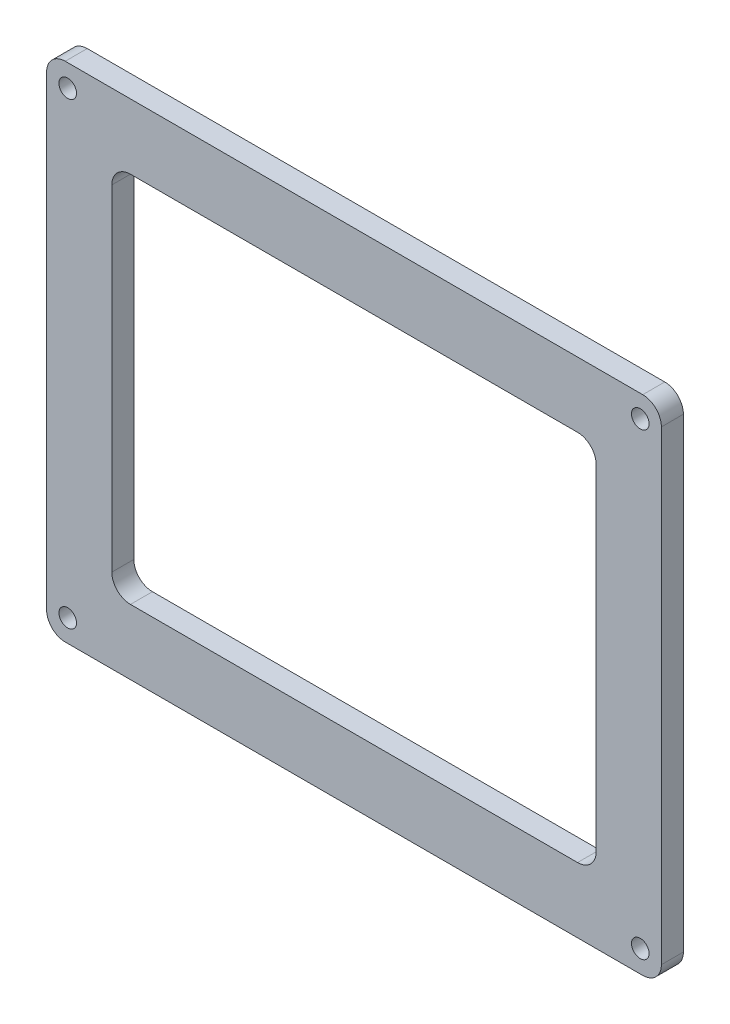
ISO-10303-21;
HEADER;
FILE_DESCRIPTION(('STEP AP214'),'2;1');
FILE_NAME('part.step','',(''),(''),'','','');
FILE_SCHEMA(('AUTOMOTIVE_DESIGN { 1 0 10303 214 1 1 1 1 }'));
ENDSEC;
DATA;
#1=APPLICATION_CONTEXT('core data for automotive mechanical design processes');
#2=APPLICATION_PROTOCOL_DEFINITION('international standard','automotive_design',2000,#1);
#3=PRODUCT_CONTEXT('',#1,'mechanical');
#4=PRODUCT('Part','Part','',(#3));
#5=PRODUCT_RELATED_PRODUCT_CATEGORY('part','',(#4));
#6=PRODUCT_DEFINITION_FORMATION('','',#4);
#7=PRODUCT_DEFINITION_CONTEXT('part definition',#1,'design');
#8=PRODUCT_DEFINITION('design','',#6,#7);
#9=PRODUCT_DEFINITION_SHAPE('','',#8);
#10=(LENGTH_UNIT() NAMED_UNIT(*) SI_UNIT(.MILLI.,.METRE.));
#11=(NAMED_UNIT(*) PLANE_ANGLE_UNIT() SI_UNIT($,.RADIAN.));
#12=(NAMED_UNIT(*) SI_UNIT($,.STERADIAN.) SOLID_ANGLE_UNIT());
#13=UNCERTAINTY_MEASURE_WITH_UNIT(LENGTH_MEASURE(1.E-05),#10,'distance_accuracy_value','');
#14=(GEOMETRIC_REPRESENTATION_CONTEXT(3) GLOBAL_UNCERTAINTY_ASSIGNED_CONTEXT((#13)) GLOBAL_UNIT_ASSIGNED_CONTEXT((#10,
#11,#12)) REPRESENTATION_CONTEXT('',''));
#15=CARTESIAN_POINT('',(0.,0.,0.));
#16=DIRECTION('',(0.,0.,1.));
#17=DIRECTION('',(1.,0.,0.));
#18=AXIS2_PLACEMENT_3D('',#15,#16,#17);
#19=CARTESIAN_POINT('',(-39.37,-31.75,3.));
#20=DIRECTION('',(0.,0.,-1.));
#21=DIRECTION('',(-1.,0.,0.));
#22=AXIS2_PLACEMENT_3D('',#19,#20,#21);
#23=PLANE('',#22);
#24=CARTESIAN_POINT('',(39.0331017122989,31.2670630679053,3.));
#25=DIRECTION('',(0.,0.,1.));
#26=DIRECTION('',(1.,0.,0.));
#27=AXIS2_PLACEMENT_3D('',#24,#25,#26);
#28=CIRCLE('',#27,1.19999999999999);
#29=CARTESIAN_POINT('',(40.2331017122989,31.2670630679053,3.));
#30=VERTEX_POINT('',#29);
#31=EDGE_CURVE('E600',#30,#30,#28,.T.);
#32=ORIENTED_EDGE('',*,*,#31,.F.);
#33=EDGE_LOOP('',(#32));
#34=FACE_BOUND('',#33,.T.);
#35=CARTESIAN_POINT('',(-39.0331017122989,-31.2670630679053,3.));
#36=DIRECTION('',(0.,0.,1.));
#37=DIRECTION('',(1.,0.,0.));
#38=AXIS2_PLACEMENT_3D('',#35,#36,#37);
#39=CIRCLE('',#38,1.19999999999999);
#40=CARTESIAN_POINT('',(-37.8331017122989,-31.2670630679053,3.));
#41=VERTEX_POINT('',#40);
#42=EDGE_CURVE('E589',#41,#41,#39,.T.);
#43=ORIENTED_EDGE('',*,*,#42,.F.);
#44=EDGE_LOOP('',(#43));
#45=FACE_BOUND('',#44,.T.);
#46=CARTESIAN_POINT('',(-39.0331017122989,31.2670630679053,3.));
#47=DIRECTION('',(0.,0.,1.));
#48=DIRECTION('',(1.,0.,0.));
#49=AXIS2_PLACEMENT_3D('',#46,#47,#48);
#50=CIRCLE('',#49,1.19999999999999);
#51=CARTESIAN_POINT('',(-37.8331017122989,31.2670630679053,3.));
#52=VERTEX_POINT('',#51);
#53=EDGE_CURVE('E584',#52,#52,#50,.T.);
#54=ORIENTED_EDGE('',*,*,#53,.F.);
#55=EDGE_LOOP('',(#54));
#56=FACE_BOUND('',#55,.T.);
#57=CARTESIAN_POINT('',(-39.37,-31.75,3.));
#58=DIRECTION('',(0.,0.,1.));
#59=DIRECTION('',(-1.,0.,0.));
#60=AXIS2_PLACEMENT_3D('',#57,#58,#59);
#61=CIRCLE('',#60,2.54);
#62=CARTESIAN_POINT('',(-41.91,-31.75,3.));
#63=VERTEX_POINT('',#62);
#64=CARTESIAN_POINT('',(-39.37,-34.29,3.));
#65=VERTEX_POINT('',#64);
#66=EDGE_CURVE('E247',#63,#65,#61,.T.);
#67=ORIENTED_EDGE('',*,*,#66,.T.);
#68=DIRECTION('',(1.,0.,0.));
#69=VECTOR('',#68,1.);
#70=CARTESIAN_POINT('',(39.37,-34.29,3.));
#71=LINE('',#70,#69);
#72=CARTESIAN_POINT('',(39.37,-34.29,3.));
#73=VERTEX_POINT('',#72);
#74=EDGE_CURVE('E252',#65,#73,#71,.T.);
#75=ORIENTED_EDGE('',*,*,#74,.T.);
#76=CARTESIAN_POINT('',(39.37,-31.75,3.));
#77=DIRECTION('',(0.,0.,1.));
#78=DIRECTION('',(-1.,0.,0.));
#79=AXIS2_PLACEMENT_3D('',#76,#77,#78);
#80=CIRCLE('',#79,2.54);
#81=CARTESIAN_POINT('',(41.91,-31.75,3.));
#82=VERTEX_POINT('',#81);
#83=EDGE_CURVE('E265',#73,#82,#80,.T.);
#84=ORIENTED_EDGE('',*,*,#83,.T.);
#85=DIRECTION('',(0.,1.,0.));
#86=VECTOR('',#85,1.);
#87=CARTESIAN_POINT('',(41.91,31.75,3.));
#88=LINE('',#87,#86);
#89=CARTESIAN_POINT('',(41.91,31.75,3.));
#90=VERTEX_POINT('',#89);
#91=EDGE_CURVE('E268',#82,#90,#88,.T.);
#92=ORIENTED_EDGE('',*,*,#91,.T.);
#93=CARTESIAN_POINT('',(39.37,31.75,3.));
#94=DIRECTION('',(0.,0.,1.));
#95=DIRECTION('',(-1.,0.,0.));
#96=AXIS2_PLACEMENT_3D('',#93,#94,#95);
#97=CIRCLE('',#96,2.54);
#98=CARTESIAN_POINT('',(39.37,34.29,3.));
#99=VERTEX_POINT('',#98);
#100=EDGE_CURVE('E272',#90,#99,#97,.T.);
#101=ORIENTED_EDGE('',*,*,#100,.T.);
#102=DIRECTION('',(-1.,0.,0.));
#103=VECTOR('',#102,1.);
#104=CARTESIAN_POINT('',(39.37,34.29,3.));
#105=LINE('',#104,#103);
#106=CARTESIAN_POINT('',(-39.37,34.29,3.));
#107=VERTEX_POINT('',#106);
#108=EDGE_CURVE('E276',#99,#107,#105,.T.);
#109=ORIENTED_EDGE('',*,*,#108,.T.);
#110=CARTESIAN_POINT('',(-39.37,31.75,3.));
#111=DIRECTION('',(0.,0.,1.));
#112=DIRECTION('',(1.,0.,0.));
#113=AXIS2_PLACEMENT_3D('',#110,#111,#112);
#114=CIRCLE('',#113,2.54);
#115=CARTESIAN_POINT('',(-41.91,31.75,3.));
#116=VERTEX_POINT('',#115);
#117=EDGE_CURVE('E282',#107,#116,#114,.T.);
#118=ORIENTED_EDGE('',*,*,#117,.T.);
#119=DIRECTION('',(0.,-1.,0.));
#120=VECTOR('',#119,1.);
#121=CARTESIAN_POINT('',(-41.91,31.75,3.));
#122=LINE('',#121,#120);
#123=EDGE_CURVE('E285',#116,#63,#122,.T.);
#124=ORIENTED_EDGE('',*,*,#123,.T.);
#125=EDGE_LOOP('',(#67,#75,#84,#92,#101,#109,#118,#124));
#126=FACE_BOUND('',#125,.T.);
#127=CARTESIAN_POINT('',(30.48,22.86,3.));
#128=DIRECTION('',(0.,0.,1.));
#129=DIRECTION('',(-1.,0.,0.));
#130=AXIS2_PLACEMENT_3D('',#127,#128,#129);
#131=CIRCLE('',#130,2.54);
#132=CARTESIAN_POINT('',(33.02,22.86,3.));
#133=VERTEX_POINT('',#132);
#134=CARTESIAN_POINT('',(30.48,25.4,3.));
#135=VERTEX_POINT('',#134);
#136=EDGE_CURVE('E155',#133,#135,#131,.T.);
#137=ORIENTED_EDGE('',*,*,#136,.F.);
#138=DIRECTION('',(0.,1.,0.));
#139=VECTOR('',#138,1.);
#140=CARTESIAN_POINT('',(33.02,22.86,3.));
#141=LINE('',#140,#139);
#142=CARTESIAN_POINT('',(33.02,-22.86,3.));
#143=VERTEX_POINT('',#142);
#144=EDGE_CURVE('E212',#143,#133,#141,.T.);
#145=ORIENTED_EDGE('',*,*,#144,.F.);
#146=CARTESIAN_POINT('',(30.48,-22.86,3.));
#147=DIRECTION('',(0.,0.,1.));
#148=DIRECTION('',(1.,0.,0.));
#149=AXIS2_PLACEMENT_3D('',#146,#147,#148);
#150=CIRCLE('',#149,2.54);
#151=CARTESIAN_POINT('',(30.48,-25.4,3.));
#152=VERTEX_POINT('',#151);
#153=EDGE_CURVE('E205',#152,#143,#150,.T.);
#154=ORIENTED_EDGE('',*,*,#153,.F.);
#155=DIRECTION('',(1.,0.,0.));
#156=VECTOR('',#155,1.);
#157=CARTESIAN_POINT('',(-30.48,-25.4,3.));
#158=LINE('',#157,#156);
#159=CARTESIAN_POINT('',(-30.48,-25.4,3.));
#160=VERTEX_POINT('',#159);
#161=EDGE_CURVE('E201',#160,#152,#158,.T.);
#162=ORIENTED_EDGE('',*,*,#161,.F.);
#163=CARTESIAN_POINT('',(-30.48,-22.86,3.));
#164=DIRECTION('',(0.,0.,1.));
#165=DIRECTION('',(1.,0.,0.));
#166=AXIS2_PLACEMENT_3D('',#163,#164,#165);
#167=CIRCLE('',#166,2.54);
#168=CARTESIAN_POINT('',(-33.02,-22.86,3.));
#169=VERTEX_POINT('',#168);
#170=EDGE_CURVE('E197',#169,#160,#167,.T.);
#171=ORIENTED_EDGE('',*,*,#170,.F.);
#172=DIRECTION('',(0.,-1.,0.));
#173=VECTOR('',#172,1.);
#174=CARTESIAN_POINT('',(-33.02,22.86,3.));
#175=LINE('',#174,#173);
#176=CARTESIAN_POINT('',(-33.02,22.86,3.));
#177=VERTEX_POINT('',#176);
#178=EDGE_CURVE('E183',#177,#169,#175,.T.);
#179=ORIENTED_EDGE('',*,*,#178,.F.);
#180=CARTESIAN_POINT('',(-30.48,22.86,3.));
#181=DIRECTION('',(0.,0.,1.));
#182=DIRECTION('',(1.,0.,0.));
#183=AXIS2_PLACEMENT_3D('',#180,#181,#182);
#184=CIRCLE('',#183,2.54);
#185=CARTESIAN_POINT('',(-30.48,25.4,3.));
#186=VERTEX_POINT('',#185);
#187=EDGE_CURVE('E178',#186,#177,#184,.T.);
#188=ORIENTED_EDGE('',*,*,#187,.F.);
#189=DIRECTION('',(-1.,0.,0.));
#190=VECTOR('',#189,1.);
#191=CARTESIAN_POINT('',(-30.48,25.4,3.));
#192=LINE('',#191,#190);
#193=EDGE_CURVE('E164',#135,#186,#192,.T.);
#194=ORIENTED_EDGE('',*,*,#193,.F.);
#195=EDGE_LOOP('',(#137,#145,#154,#162,#171,#179,#188,#194));
#196=FACE_BOUND('',#195,.T.);
#197=CARTESIAN_POINT('',(39.0331017122989,-31.2670630679053,3.));
#198=DIRECTION('',(0.,0.,1.));
#199=DIRECTION('',(1.,0.,0.));
#200=AXIS2_PLACEMENT_3D('',#197,#198,#199);
#201=CIRCLE('',#200,1.19999999999999);
#202=CARTESIAN_POINT('',(40.2331017122989,-31.2670630679053,3.));
#203=VERTEX_POINT('',#202);
#204=EDGE_CURVE('E595',#203,#203,#201,.T.);
#205=ORIENTED_EDGE('',*,*,#204,.F.);
#206=EDGE_LOOP('',(#205));
#207=FACE_BOUND('',#206,.T.);
#208=ADVANCED_FACE('F41',(#34,#45,#56,#126,#196,#207),#23,.F.);
#209=CARTESIAN_POINT('',(-39.37,-31.75,0.));
#210=DIRECTION('',(0.,0.,-1.));
#211=DIRECTION('',(-1.,0.,0.));
#212=AXIS2_PLACEMENT_3D('',#209,#210,#211);
#213=PLANE('',#212);
#214=CARTESIAN_POINT('',(39.0331017122989,31.2670630679053,0.));
#215=DIRECTION('',(0.,0.,-1.));
#216=DIRECTION('',(-1.,0.,0.));
#217=AXIS2_PLACEMENT_3D('',#214,#215,#216);
#218=CIRCLE('',#217,1.19999999999999);
#219=CARTESIAN_POINT('',(37.8331017122989,31.2670630679053,0.));
#220=VERTEX_POINT('',#219);
#221=EDGE_CURVE('E604',#220,#220,#218,.T.);
#222=ORIENTED_EDGE('',*,*,#221,.F.);
#223=EDGE_LOOP('',(#222));
#224=FACE_BOUND('',#223,.T.);
#225=CARTESIAN_POINT('',(39.0331017122989,-31.2670630679053,0.));
#226=DIRECTION('',(0.,0.,-1.));
#227=DIRECTION('',(-1.,0.,0.));
#228=AXIS2_PLACEMENT_3D('',#225,#226,#227);
#229=CIRCLE('',#228,1.19999999999999);
#230=CARTESIAN_POINT('',(37.8331017122989,-31.2670630679053,0.));
#231=VERTEX_POINT('',#230);
#232=EDGE_CURVE('E45',#231,#231,#229,.T.);
#233=ORIENTED_EDGE('',*,*,#232,.F.);
#234=EDGE_LOOP('',(#233));
#235=FACE_BOUND('',#234,.T.);
#236=CARTESIAN_POINT('',(-39.0331017122989,-31.2670630679053,0.));
#237=DIRECTION('',(0.,0.,-1.));
#238=DIRECTION('',(-1.,0.,0.));
#239=AXIS2_PLACEMENT_3D('',#236,#237,#238);
#240=CIRCLE('',#239,1.19999999999999);
#241=CARTESIAN_POINT('',(-40.2331017122989,-31.2670630679053,0.));
#242=VERTEX_POINT('',#241);
#243=EDGE_CURVE('E586',#242,#242,#240,.T.);
#244=ORIENTED_EDGE('',*,*,#243,.F.);
#245=EDGE_LOOP('',(#244));
#246=FACE_BOUND('',#245,.T.);
#247=CARTESIAN_POINT('',(-39.0331017122989,31.2670630679053,0.));
#248=DIRECTION('',(0.,0.,-1.));
#249=DIRECTION('',(-1.,0.,0.));
#250=AXIS2_PLACEMENT_3D('',#247,#248,#249);
#251=CIRCLE('',#250,1.19999999999999);
#252=CARTESIAN_POINT('',(-40.2331017122989,31.2670630679053,0.));
#253=VERTEX_POINT('',#252);
#254=EDGE_CURVE('E217',#253,#253,#251,.T.);
#255=ORIENTED_EDGE('',*,*,#254,.F.);
#256=EDGE_LOOP('',(#255));
#257=FACE_BOUND('',#256,.T.);
#258=CARTESIAN_POINT('',(-39.37,-31.75,0.));
#259=DIRECTION('',(0.,0.,1.));
#260=DIRECTION('',(-1.,0.,0.));
#261=AXIS2_PLACEMENT_3D('',#258,#259,#260);
#262=CIRCLE('',#261,2.54);
#263=CARTESIAN_POINT('',(-41.91,-31.75,0.));
#264=VERTEX_POINT('',#263);
#265=CARTESIAN_POINT('',(-39.37,-34.29,0.));
#266=VERTEX_POINT('',#265);
#267=EDGE_CURVE('E172',#264,#266,#262,.T.);
#268=ORIENTED_EDGE('',*,*,#267,.F.);
#269=DIRECTION('',(0.,-1.,0.));
#270=VECTOR('',#269,1.);
#271=CARTESIAN_POINT('',(-41.91,31.75,0.));
#272=LINE('',#271,#270);
#273=CARTESIAN_POINT('',(-41.91,31.75,0.));
#274=VERTEX_POINT('',#273);
#275=EDGE_CURVE('E253',#274,#264,#272,.T.);
#276=ORIENTED_EDGE('',*,*,#275,.F.);
#277=CARTESIAN_POINT('',(-39.37,31.75,0.));
#278=DIRECTION('',(0.,0.,1.));
#279=DIRECTION('',(1.,0.,0.));
#280=AXIS2_PLACEMENT_3D('',#277,#278,#279);
#281=CIRCLE('',#280,2.54);
#282=CARTESIAN_POINT('',(-39.37,34.29,0.));
#283=VERTEX_POINT('',#282);
#284=EDGE_CURVE('E302',#283,#274,#281,.T.);
#285=ORIENTED_EDGE('',*,*,#284,.F.);
#286=DIRECTION('',(-1.,0.,0.));
#287=VECTOR('',#286,1.);
#288=CARTESIAN_POINT('',(39.37,34.29,0.));
#289=LINE('',#288,#287);
#290=CARTESIAN_POINT('',(39.37,34.29,0.));
#291=VERTEX_POINT('',#290);
#292=EDGE_CURVE('E300',#291,#283,#289,.T.);
#293=ORIENTED_EDGE('',*,*,#292,.F.);
#294=CARTESIAN_POINT('',(39.37,31.75,0.));
#295=DIRECTION('',(0.,0.,1.));
#296=DIRECTION('',(-1.,0.,0.));
#297=AXIS2_PLACEMENT_3D('',#294,#295,#296);
#298=CIRCLE('',#297,2.54);
#299=CARTESIAN_POINT('',(41.91,31.75,0.));
#300=VERTEX_POINT('',#299);
#301=EDGE_CURVE('E298',#300,#291,#298,.T.);
#302=ORIENTED_EDGE('',*,*,#301,.F.);
#303=DIRECTION('',(0.,1.,0.));
#304=VECTOR('',#303,1.);
#305=CARTESIAN_POINT('',(41.91,31.75,0.));
#306=LINE('',#305,#304);
#307=CARTESIAN_POINT('',(41.91,-31.75,0.));
#308=VERTEX_POINT('',#307);
#309=EDGE_CURVE('E296',#308,#300,#306,.T.);
#310=ORIENTED_EDGE('',*,*,#309,.F.);
#311=CARTESIAN_POINT('',(39.37,-31.75,0.));
#312=DIRECTION('',(0.,0.,1.));
#313=DIRECTION('',(-1.,0.,0.));
#314=AXIS2_PLACEMENT_3D('',#311,#312,#313);
#315=CIRCLE('',#314,2.54);
#316=CARTESIAN_POINT('',(39.37,-34.29,0.));
#317=VERTEX_POINT('',#316);
#318=EDGE_CURVE('E294',#317,#308,#315,.T.);
#319=ORIENTED_EDGE('',*,*,#318,.F.);
#320=DIRECTION('',(1.,0.,0.));
#321=VECTOR('',#320,1.);
#322=CARTESIAN_POINT('',(39.37,-34.29,0.));
#323=LINE('',#322,#321);
#324=EDGE_CURVE('E292',#266,#317,#323,.T.);
#325=ORIENTED_EDGE('',*,*,#324,.F.);
#326=EDGE_LOOP('',(#268,#276,#285,#293,#302,#310,#319,#325));
#327=FACE_BOUND('',#326,.T.);
#328=DIRECTION('',(0.,1.,0.));
#329=VECTOR('',#328,1.);
#330=CARTESIAN_POINT('',(33.02,22.86,0.));
#331=LINE('',#330,#329);
#332=CARTESIAN_POINT('',(33.02,-22.86,0.));
#333=VERTEX_POINT('',#332);
#334=CARTESIAN_POINT('',(33.02,22.86,0.));
#335=VERTEX_POINT('',#334);
#336=EDGE_CURVE('E165',#333,#335,#331,.T.);
#337=ORIENTED_EDGE('',*,*,#336,.T.);
#338=CARTESIAN_POINT('',(30.48,22.86,0.));
#339=DIRECTION('',(0.,0.,1.));
#340=DIRECTION('',(-1.,0.,0.));
#341=AXIS2_PLACEMENT_3D('',#338,#339,#340);
#342=CIRCLE('',#341,2.54);
#343=CARTESIAN_POINT('',(30.48,25.4,0.));
#344=VERTEX_POINT('',#343);
#345=EDGE_CURVE('E65',#335,#344,#342,.T.);
#346=ORIENTED_EDGE('',*,*,#345,.T.);
#347=DIRECTION('',(-1.,0.,0.));
#348=VECTOR('',#347,1.);
#349=CARTESIAN_POINT('',(-30.48,25.4,0.));
#350=LINE('',#349,#348);
#351=CARTESIAN_POINT('',(-30.48,25.4,0.));
#352=VERTEX_POINT('',#351);
#353=EDGE_CURVE('E171',#344,#352,#350,.T.);
#354=ORIENTED_EDGE('',*,*,#353,.T.);
#355=CARTESIAN_POINT('',(-30.48,22.86,0.));
#356=DIRECTION('',(0.,0.,1.));
#357=DIRECTION('',(1.,0.,0.));
#358=AXIS2_PLACEMENT_3D('',#355,#356,#357);
#359=CIRCLE('',#358,2.54);
#360=CARTESIAN_POINT('',(-33.02,22.86,0.));
#361=VERTEX_POINT('',#360);
#362=EDGE_CURVE('E219',#352,#361,#359,.T.);
#363=ORIENTED_EDGE('',*,*,#362,.T.);
#364=DIRECTION('',(0.,-1.,0.));
#365=VECTOR('',#364,1.);
#366=CARTESIAN_POINT('',(-33.02,22.86,0.));
#367=LINE('',#366,#365);
#368=CARTESIAN_POINT('',(-33.02,-22.86,0.));
#369=VERTEX_POINT('',#368);
#370=EDGE_CURVE('E222',#361,#369,#367,.T.);
#371=ORIENTED_EDGE('',*,*,#370,.T.);
#372=CARTESIAN_POINT('',(-30.48,-22.86,0.));
#373=DIRECTION('',(0.,0.,1.));
#374=DIRECTION('',(1.,0.,0.));
#375=AXIS2_PLACEMENT_3D('',#372,#373,#374);
#376=CIRCLE('',#375,2.54);
#377=CARTESIAN_POINT('',(-30.48,-25.4,0.));
#378=VERTEX_POINT('',#377);
#379=EDGE_CURVE('E225',#369,#378,#376,.T.);
#380=ORIENTED_EDGE('',*,*,#379,.T.);
#381=DIRECTION('',(1.,0.,0.));
#382=VECTOR('',#381,1.);
#383=CARTESIAN_POINT('',(-30.48,-25.4,0.));
#384=LINE('',#383,#382);
#385=CARTESIAN_POINT('',(30.48,-25.4,0.));
#386=VERTEX_POINT('',#385);
#387=EDGE_CURVE('E228',#378,#386,#384,.T.);
#388=ORIENTED_EDGE('',*,*,#387,.T.);
#389=CARTESIAN_POINT('',(30.48,-22.86,0.));
#390=DIRECTION('',(0.,0.,1.));
#391=DIRECTION('',(1.,0.,0.));
#392=AXIS2_PLACEMENT_3D('',#389,#390,#391);
#393=CIRCLE('',#392,2.54);
#394=EDGE_CURVE('E231',#386,#333,#393,.T.);
#395=ORIENTED_EDGE('',*,*,#394,.T.);
#396=EDGE_LOOP('',(#337,#346,#354,#363,#371,#380,#388,#395));
#397=FACE_BOUND('',#396,.T.);
#398=ADVANCED_FACE('F333',(#224,#235,#246,#257,#327,#397),#213,.T.);
#399=CARTESIAN_POINT('',(-39.37,-31.75,3.));
#400=DIRECTION('',(0.,0.,-1.));
#401=DIRECTION('',(-1.,0.,0.));
#402=AXIS2_PLACEMENT_3D('',#399,#400,#401);
#403=CYLINDRICAL_SURFACE('',#402,2.54);
#404=ORIENTED_EDGE('',*,*,#267,.T.);
#405=DIRECTION('',(0.,0.,-1.));
#406=VECTOR('',#405,1.);
#407=CARTESIAN_POINT('',(-39.37,-34.29,3.));
#408=LINE('',#407,#406);
#409=EDGE_CURVE('E12',#65,#266,#408,.T.);
#410=ORIENTED_EDGE('',*,*,#409,.F.);
#411=ORIENTED_EDGE('',*,*,#66,.F.);
#412=DIRECTION('',(0.,0.,-1.));
#413=VECTOR('',#412,1.);
#414=CARTESIAN_POINT('',(-41.91,-31.75,3.));
#415=LINE('',#414,#413);
#416=EDGE_CURVE('E289',#63,#264,#415,.T.);
#417=ORIENTED_EDGE('',*,*,#416,.T.);
#418=EDGE_LOOP('',(#404,#410,#411,#417));
#419=FACE_BOUND('',#418,.T.);
#420=ADVANCED_FACE('F43',(#419),#403,.T.);
#421=CARTESIAN_POINT('',(39.37,-34.29,3.));
#422=DIRECTION('',(0.,1.,0.));
#423=DIRECTION('',(-1.,0.,0.));
#424=AXIS2_PLACEMENT_3D('',#421,#422,#423);
#425=PLANE('',#424);
#426=ORIENTED_EDGE('',*,*,#324,.T.);
#427=DIRECTION('',(0.,0.,-1.));
#428=VECTOR('',#427,1.);
#429=CARTESIAN_POINT('',(39.37,-34.29,3.));
#430=LINE('',#429,#428);
#431=EDGE_CURVE('E50',#73,#317,#430,.T.);
#432=ORIENTED_EDGE('',*,*,#431,.F.);
#433=ORIENTED_EDGE('',*,*,#74,.F.);
#434=ORIENTED_EDGE('',*,*,#409,.T.);
#435=EDGE_LOOP('',(#426,#432,#433,#434));
#436=FACE_BOUND('',#435,.T.);
#437=ADVANCED_FACE('F414',(#436),#425,.F.);
#438=CARTESIAN_POINT('',(39.37,-31.75,3.));
#439=DIRECTION('',(0.,0.,-1.));
#440=DIRECTION('',(-1.,0.,0.));
#441=AXIS2_PLACEMENT_3D('',#438,#439,#440);
#442=CYLINDRICAL_SURFACE('',#441,2.54);
#443=ORIENTED_EDGE('',*,*,#318,.T.);
#444=DIRECTION('',(0.,0.,-1.));
#445=VECTOR('',#444,1.);
#446=CARTESIAN_POINT('',(41.91,-31.75,3.));
#447=LINE('',#446,#445);
#448=EDGE_CURVE('E319',#82,#308,#447,.T.);
#449=ORIENTED_EDGE('',*,*,#448,.F.);
#450=ORIENTED_EDGE('',*,*,#83,.F.);
#451=ORIENTED_EDGE('',*,*,#431,.T.);
#452=EDGE_LOOP('',(#443,#449,#450,#451));
#453=FACE_BOUND('',#452,.T.);
#454=ADVANCED_FACE('F327',(#453),#442,.T.);
#455=CARTESIAN_POINT('',(41.91,31.75,3.));
#456=DIRECTION('',(-1.,0.,0.));
#457=DIRECTION('',(0.,-1.,0.));
#458=AXIS2_PLACEMENT_3D('',#455,#456,#457);
#459=PLANE('',#458);
#460=ORIENTED_EDGE('',*,*,#309,.T.);
#461=DIRECTION('',(0.,0.,-1.));
#462=VECTOR('',#461,1.);
#463=CARTESIAN_POINT('',(41.91,31.75,3.));
#464=LINE('',#463,#462);
#465=EDGE_CURVE('E316',#90,#300,#464,.T.);
#466=ORIENTED_EDGE('',*,*,#465,.F.);
#467=ORIENTED_EDGE('',*,*,#91,.F.);
#468=ORIENTED_EDGE('',*,*,#448,.T.);
#469=EDGE_LOOP('',(#460,#466,#467,#468));
#470=FACE_BOUND('',#469,.T.);
#471=ADVANCED_FACE('F339',(#470),#459,.F.);
#472=CARTESIAN_POINT('',(39.37,31.75,3.));
#473=DIRECTION('',(0.,0.,-1.));
#474=DIRECTION('',(-1.,0.,0.));
#475=AXIS2_PLACEMENT_3D('',#472,#473,#474);
#476=CYLINDRICAL_SURFACE('',#475,2.54);
#477=ORIENTED_EDGE('',*,*,#301,.T.);
#478=DIRECTION('',(0.,0.,-1.));
#479=VECTOR('',#478,1.);
#480=CARTESIAN_POINT('',(39.37,34.29,3.));
#481=LINE('',#480,#479);
#482=EDGE_CURVE('E313',#99,#291,#481,.T.);
#483=ORIENTED_EDGE('',*,*,#482,.F.);
#484=ORIENTED_EDGE('',*,*,#100,.F.);
#485=ORIENTED_EDGE('',*,*,#465,.T.);
#486=EDGE_LOOP('',(#477,#483,#484,#485));
#487=FACE_BOUND('',#486,.T.);
#488=ADVANCED_FACE('F343',(#487),#476,.T.);
#489=CARTESIAN_POINT('',(39.37,34.29,3.));
#490=DIRECTION('',(0.,-1.,0.));
#491=DIRECTION('',(1.,0.,0.));
#492=AXIS2_PLACEMENT_3D('',#489,#490,#491);
#493=PLANE('',#492);
#494=ORIENTED_EDGE('',*,*,#292,.T.);
#495=DIRECTION('',(0.,0.,-1.));
#496=VECTOR('',#495,1.);
#497=CARTESIAN_POINT('',(-39.37,34.29,3.));
#498=LINE('',#497,#496);
#499=EDGE_CURVE('E310',#107,#283,#498,.T.);
#500=ORIENTED_EDGE('',*,*,#499,.F.);
#501=ORIENTED_EDGE('',*,*,#108,.F.);
#502=ORIENTED_EDGE('',*,*,#482,.T.);
#503=EDGE_LOOP('',(#494,#500,#501,#502));
#504=FACE_BOUND('',#503,.T.);
#505=ADVANCED_FACE('F404',(#504),#493,.F.);
#506=CARTESIAN_POINT('',(-39.37,31.75,3.));
#507=DIRECTION('',(0.,0.,-1.));
#508=DIRECTION('',(-1.,0.,0.));
#509=AXIS2_PLACEMENT_3D('',#506,#507,#508);
#510=CYLINDRICAL_SURFACE('',#509,2.54);
#511=ORIENTED_EDGE('',*,*,#284,.T.);
#512=DIRECTION('',(0.,0.,-1.));
#513=VECTOR('',#512,1.);
#514=CARTESIAN_POINT('',(-41.91,31.75,3.));
#515=LINE('',#514,#513);
#516=EDGE_CURVE('E307',#116,#274,#515,.T.);
#517=ORIENTED_EDGE('',*,*,#516,.F.);
#518=ORIENTED_EDGE('',*,*,#117,.F.);
#519=ORIENTED_EDGE('',*,*,#499,.T.);
#520=EDGE_LOOP('',(#511,#517,#518,#519));
#521=FACE_BOUND('',#520,.T.);
#522=ADVANCED_FACE('F400',(#521),#510,.T.);
#523=CARTESIAN_POINT('',(-41.91,31.75,3.));
#524=DIRECTION('',(1.,0.,0.));
#525=DIRECTION('',(0.,1.,0.));
#526=AXIS2_PLACEMENT_3D('',#523,#524,#525);
#527=PLANE('',#526);
#528=ORIENTED_EDGE('',*,*,#275,.T.);
#529=ORIENTED_EDGE('',*,*,#416,.F.);
#530=ORIENTED_EDGE('',*,*,#123,.F.);
#531=ORIENTED_EDGE('',*,*,#516,.T.);
#532=EDGE_LOOP('',(#528,#529,#530,#531));
#533=FACE_BOUND('',#532,.T.);
#534=ADVANCED_FACE('F397',(#533),#527,.F.);
#535=CARTESIAN_POINT('',(30.48,22.86,3.));
#536=DIRECTION('',(0.,0.,-1.));
#537=DIRECTION('',(-1.,0.,0.));
#538=AXIS2_PLACEMENT_3D('',#535,#536,#537);
#539=CYLINDRICAL_SURFACE('',#538,2.54);
#540=ORIENTED_EDGE('',*,*,#345,.F.);
#541=DIRECTION('',(0.,0.,-1.));
#542=VECTOR('',#541,1.);
#543=CARTESIAN_POINT('',(33.02,22.86,3.));
#544=LINE('',#543,#542);
#545=EDGE_CURVE('E159',#133,#335,#544,.T.);
#546=ORIENTED_EDGE('',*,*,#545,.F.);
#547=ORIENTED_EDGE('',*,*,#136,.T.);
#548=DIRECTION('',(0.,0.,-1.));
#549=VECTOR('',#548,1.);
#550=CARTESIAN_POINT('',(30.48,25.4,3.));
#551=LINE('',#550,#549);
#552=EDGE_CURVE('E158',#135,#344,#551,.T.);
#553=ORIENTED_EDGE('',*,*,#552,.T.);
#554=EDGE_LOOP('',(#540,#546,#547,#553));
#555=FACE_BOUND('',#554,.T.);
#556=ADVANCED_FACE('F157',(#555),#539,.F.);
#557=CARTESIAN_POINT('',(-30.48,25.4,3.));
#558=DIRECTION('',(0.,-1.,0.));
#559=DIRECTION('',(0.,0.,-1.));
#560=AXIS2_PLACEMENT_3D('',#557,#558,#559);
#561=PLANE('',#560);
#562=ORIENTED_EDGE('',*,*,#353,.F.);
#563=ORIENTED_EDGE('',*,*,#552,.F.);
#564=ORIENTED_EDGE('',*,*,#193,.T.);
#565=DIRECTION('',(0.,0.,-1.));
#566=VECTOR('',#565,1.);
#567=CARTESIAN_POINT('',(-30.48,25.4,3.));
#568=LINE('',#567,#566);
#569=EDGE_CURVE('E173',#186,#352,#568,.T.);
#570=ORIENTED_EDGE('',*,*,#569,.T.);
#571=EDGE_LOOP('',(#562,#563,#564,#570));
#572=FACE_BOUND('',#571,.T.);
#573=ADVANCED_FACE('F168',(#572),#561,.T.);
#574=CARTESIAN_POINT('',(-30.48,22.86,3.));
#575=DIRECTION('',(0.,0.,-1.));
#576=DIRECTION('',(-1.,0.,0.));
#577=AXIS2_PLACEMENT_3D('',#574,#575,#576);
#578=CYLINDRICAL_SURFACE('',#577,2.54);
#579=ORIENTED_EDGE('',*,*,#362,.F.);
#580=ORIENTED_EDGE('',*,*,#569,.F.);
#581=ORIENTED_EDGE('',*,*,#187,.T.);
#582=DIRECTION('',(0.,0.,-1.));
#583=VECTOR('',#582,1.);
#584=CARTESIAN_POINT('',(-33.02,22.86,3.));
#585=LINE('',#584,#583);
#586=EDGE_CURVE('E244',#177,#361,#585,.T.);
#587=ORIENTED_EDGE('',*,*,#586,.T.);
#588=EDGE_LOOP('',(#579,#580,#581,#587));
#589=FACE_BOUND('',#588,.T.);
#590=ADVANCED_FACE('F376',(#589),#578,.F.);
#591=CARTESIAN_POINT('',(-33.02,22.86,3.));
#592=DIRECTION('',(1.,0.,0.));
#593=DIRECTION('',(0.,1.,0.));
#594=AXIS2_PLACEMENT_3D('',#591,#592,#593);
#595=PLANE('',#594);
#596=ORIENTED_EDGE('',*,*,#370,.F.);
#597=ORIENTED_EDGE('',*,*,#586,.F.);
#598=ORIENTED_EDGE('',*,*,#178,.T.);
#599=DIRECTION('',(0.,0.,-1.));
#600=VECTOR('',#599,1.);
#601=CARTESIAN_POINT('',(-33.02,-22.86,3.));
#602=LINE('',#601,#600);
#603=EDGE_CURVE('E242',#169,#369,#602,.T.);
#604=ORIENTED_EDGE('',*,*,#603,.T.);
#605=EDGE_LOOP('',(#596,#597,#598,#604));
#606=FACE_BOUND('',#605,.T.);
#607=ADVANCED_FACE('F372',(#606),#595,.T.);
#608=CARTESIAN_POINT('',(-30.48,-22.86,3.));
#609=DIRECTION('',(0.,0.,-1.));
#610=DIRECTION('',(-1.,0.,0.));
#611=AXIS2_PLACEMENT_3D('',#608,#609,#610);
#612=CYLINDRICAL_SURFACE('',#611,2.54);
#613=ORIENTED_EDGE('',*,*,#379,.F.);
#614=ORIENTED_EDGE('',*,*,#603,.F.);
#615=ORIENTED_EDGE('',*,*,#170,.T.);
#616=DIRECTION('',(0.,0.,-1.));
#617=VECTOR('',#616,1.);
#618=CARTESIAN_POINT('',(-30.48,-25.4,3.));
#619=LINE('',#618,#617);
#620=EDGE_CURVE('E240',#160,#378,#619,.T.);
#621=ORIENTED_EDGE('',*,*,#620,.T.);
#622=EDGE_LOOP('',(#613,#614,#615,#621));
#623=FACE_BOUND('',#622,.T.);
#624=ADVANCED_FACE('F369',(#623),#612,.F.);
#625=CARTESIAN_POINT('',(-30.48,-25.4,3.));
#626=DIRECTION('',(0.,1.,0.));
#627=DIRECTION('',(0.,0.,1.));
#628=AXIS2_PLACEMENT_3D('',#625,#626,#627);
#629=PLANE('',#628);
#630=ORIENTED_EDGE('',*,*,#387,.F.);
#631=ORIENTED_EDGE('',*,*,#620,.F.);
#632=ORIENTED_EDGE('',*,*,#161,.T.);
#633=DIRECTION('',(0.,0.,-1.));
#634=VECTOR('',#633,1.);
#635=CARTESIAN_POINT('',(30.48,-25.4,3.));
#636=LINE('',#635,#634);
#637=EDGE_CURVE('E238',#152,#386,#636,.T.);
#638=ORIENTED_EDGE('',*,*,#637,.T.);
#639=EDGE_LOOP('',(#630,#631,#632,#638));
#640=FACE_BOUND('',#639,.T.);
#641=ADVANCED_FACE('F365',(#640),#629,.T.);
#642=CARTESIAN_POINT('',(30.48,-22.86,3.));
#643=DIRECTION('',(0.,0.,-1.));
#644=DIRECTION('',(-1.,0.,0.));
#645=AXIS2_PLACEMENT_3D('',#642,#643,#644);
#646=CYLINDRICAL_SURFACE('',#645,2.54);
#647=ORIENTED_EDGE('',*,*,#394,.F.);
#648=ORIENTED_EDGE('',*,*,#637,.F.);
#649=ORIENTED_EDGE('',*,*,#153,.T.);
#650=DIRECTION('',(0.,0.,-1.));
#651=VECTOR('',#650,1.);
#652=CARTESIAN_POINT('',(33.02,-22.86,3.));
#653=LINE('',#652,#651);
#654=EDGE_CURVE('E57',#143,#333,#653,.T.);
#655=ORIENTED_EDGE('',*,*,#654,.T.);
#656=EDGE_LOOP('',(#647,#648,#649,#655));
#657=FACE_BOUND('',#656,.T.);
#658=ADVANCED_FACE('F358',(#657),#646,.F.);
#659=CARTESIAN_POINT('',(33.02,22.86,3.));
#660=DIRECTION('',(-1.,0.,0.));
#661=DIRECTION('',(0.,-1.,0.));
#662=AXIS2_PLACEMENT_3D('',#659,#660,#661);
#663=PLANE('',#662);
#664=ORIENTED_EDGE('',*,*,#336,.F.);
#665=ORIENTED_EDGE('',*,*,#654,.F.);
#666=ORIENTED_EDGE('',*,*,#144,.T.);
#667=ORIENTED_EDGE('',*,*,#545,.T.);
#668=EDGE_LOOP('',(#664,#665,#666,#667));
#669=FACE_BOUND('',#668,.T.);
#670=ADVANCED_FACE('F360',(#669),#663,.T.);
#671=CARTESIAN_POINT('',(-39.0331017122989,31.2670630679053,3.));
#672=DIRECTION('',(0.,0.,1.));
#673=DIRECTION('',(1.,0.,0.));
#674=AXIS2_PLACEMENT_3D('',#671,#672,#673);
#675=CYLINDRICAL_SURFACE('',#674,1.19999999999999);
#676=ORIENTED_EDGE('',*,*,#254,.T.);
#677=EDGE_LOOP('',(#676));
#678=FACE_BOUND('',#677,.T.);
#679=ORIENTED_EDGE('',*,*,#53,.T.);
#680=EDGE_LOOP('',(#679));
#681=FACE_BOUND('',#680,.T.);
#682=ADVANCED_FACE('F465',(#678,#681),#675,.F.);
#683=CARTESIAN_POINT('',(-39.0331017122989,-31.2670630679053,3.));
#684=DIRECTION('',(0.,0.,1.));
#685=DIRECTION('',(1.,0.,0.));
#686=AXIS2_PLACEMENT_3D('',#683,#684,#685);
#687=CYLINDRICAL_SURFACE('',#686,1.19999999999999);
#688=ORIENTED_EDGE('',*,*,#243,.T.);
#689=EDGE_LOOP('',(#688));
#690=FACE_BOUND('',#689,.T.);
#691=ORIENTED_EDGE('',*,*,#42,.T.);
#692=EDGE_LOOP('',(#691));
#693=FACE_BOUND('',#692,.T.);
#694=ADVANCED_FACE('F446',(#690,#693),#687,.F.);
#695=CARTESIAN_POINT('',(39.0331017122989,-31.2670630679053,3.));
#696=DIRECTION('',(0.,0.,1.));
#697=DIRECTION('',(1.,0.,0.));
#698=AXIS2_PLACEMENT_3D('',#695,#696,#697);
#699=CYLINDRICAL_SURFACE('',#698,1.19999999999999);
#700=ORIENTED_EDGE('',*,*,#232,.T.);
#701=EDGE_LOOP('',(#700));
#702=FACE_BOUND('',#701,.T.);
#703=ORIENTED_EDGE('',*,*,#204,.T.);
#704=EDGE_LOOP('',(#703));
#705=FACE_BOUND('',#704,.T.);
#706=ADVANCED_FACE('F440',(#702,#705),#699,.F.);
#707=CARTESIAN_POINT('',(39.0331017122989,31.2670630679053,3.));
#708=DIRECTION('',(0.,0.,1.));
#709=DIRECTION('',(1.,0.,0.));
#710=AXIS2_PLACEMENT_3D('',#707,#708,#709);
#711=CYLINDRICAL_SURFACE('',#710,1.19999999999999);
#712=ORIENTED_EDGE('',*,*,#221,.T.);
#713=EDGE_LOOP('',(#712));
#714=FACE_BOUND('',#713,.T.);
#715=ORIENTED_EDGE('',*,*,#31,.T.);
#716=EDGE_LOOP('',(#715));
#717=FACE_BOUND('',#716,.T.);
#718=ADVANCED_FACE('F445',(#714,#717),#711,.F.);
#719=CLOSED_SHELL('',(#208,#398,#420,#437,#454,#471,#488,#505,#522,#534,#556,#573,#590,#607,
#624,#641,#658,#670,#682,#694,#706,#718));
#720=MANIFOLD_SOLID_BREP('B2',#719);
#721=ADVANCED_BREP_SHAPE_REPRESENTATION('',(#18,#720),#14);
#722=SHAPE_DEFINITION_REPRESENTATION(#9,#721);
ENDSEC;
END-ISO-10303-21;
